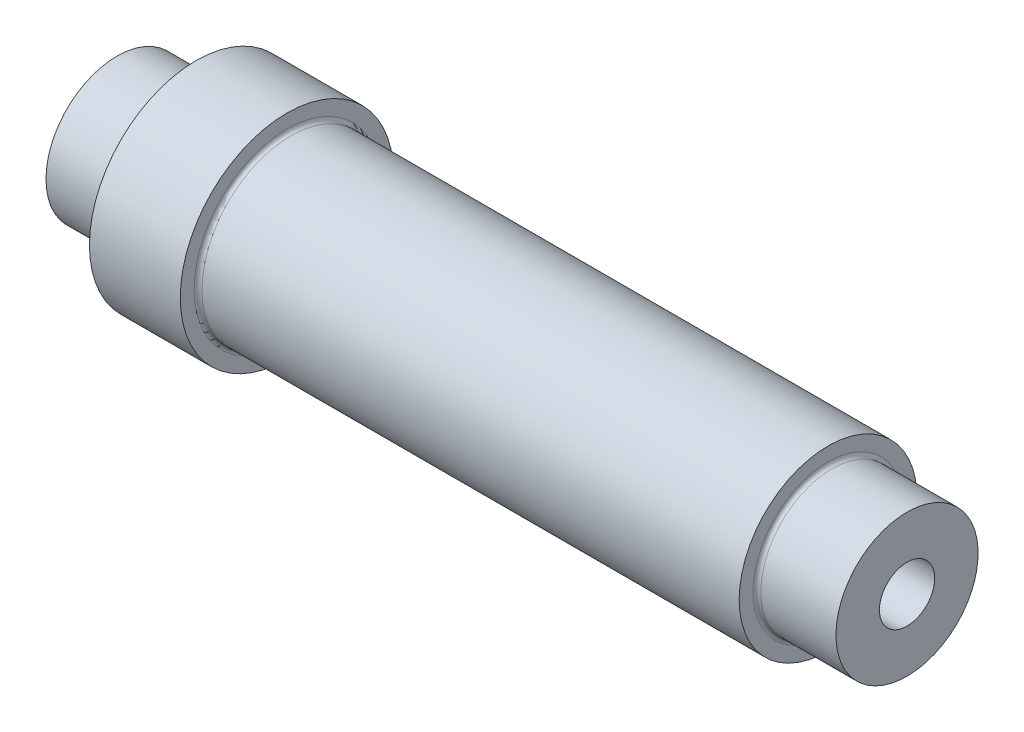
ISO-10303-21;
HEADER;
FILE_DESCRIPTION(('STEP AP214'),'2;1');
FILE_NAME('part.step','',(''),(''),'','','');
FILE_SCHEMA(('AUTOMOTIVE_DESIGN { 1 0 10303 214 1 1 1 1 }'));
ENDSEC;
DATA;
#1=APPLICATION_CONTEXT('core data for automotive mechanical design processes');
#2=APPLICATION_PROTOCOL_DEFINITION('international standard','automotive_design',2000,#1);
#3=PRODUCT_CONTEXT('',#1,'mechanical');
#4=PRODUCT('Part','Part','',(#3));
#5=PRODUCT_RELATED_PRODUCT_CATEGORY('part','',(#4));
#6=PRODUCT_DEFINITION_FORMATION('','',#4);
#7=PRODUCT_DEFINITION_CONTEXT('part definition',#1,'design');
#8=PRODUCT_DEFINITION('design','',#6,#7);
#9=PRODUCT_DEFINITION_SHAPE('','',#8);
#10=(LENGTH_UNIT() NAMED_UNIT(*) SI_UNIT(.MILLI.,.METRE.));
#11=(NAMED_UNIT(*) PLANE_ANGLE_UNIT() SI_UNIT($,.RADIAN.));
#12=(NAMED_UNIT(*) SI_UNIT($,.STERADIAN.) SOLID_ANGLE_UNIT());
#13=UNCERTAINTY_MEASURE_WITH_UNIT(LENGTH_MEASURE(1.E-05),#10,'distance_accuracy_value','');
#14=(GEOMETRIC_REPRESENTATION_CONTEXT(3) GLOBAL_UNCERTAINTY_ASSIGNED_CONTEXT((#13)) GLOBAL_UNIT_ASSIGNED_CONTEXT((#10,
#11,#12)) REPRESENTATION_CONTEXT('',''));
#15=CARTESIAN_POINT('',(0.,0.,0.));
#16=DIRECTION('',(0.,0.,1.));
#17=DIRECTION('',(1.,0.,0.));
#18=AXIS2_PLACEMENT_3D('',#15,#16,#17);
#19=CARTESIAN_POINT('',(0.,0.,0.));
#20=DIRECTION('',(1.,0.,0.));
#21=DIRECTION('',(0.,0.,-1.));
#22=AXIS2_PLACEMENT_3D('',#19,#20,#21);
#23=PLANE('',#22);
#24=CARTESIAN_POINT('',(0.,0.,0.));
#25=DIRECTION('',(-1.,0.,0.));
#26=DIRECTION('',(0.,0.,1.));
#27=AXIS2_PLACEMENT_3D('',#24,#25,#26);
#28=CIRCLE('',#27,7.);
#29=CARTESIAN_POINT('',(0.,0.,7.));
#30=VERTEX_POINT('',#29);
#31=EDGE_CURVE('E57',#30,#30,#28,.T.);
#32=ORIENTED_EDGE('',*,*,#31,.F.);
#33=EDGE_LOOP('',(#32));
#34=FACE_BOUND('',#33,.T.);
#35=CARTESIAN_POINT('',(0.,0.,0.));
#36=DIRECTION('',(-1.,0.,0.));
#37=DIRECTION('',(0.,0.,1.));
#38=AXIS2_PLACEMENT_3D('',#35,#36,#37);
#39=CIRCLE('',#38,18.);
#40=CARTESIAN_POINT('',(0.,0.,18.));
#41=VERTEX_POINT('',#40);
#42=EDGE_CURVE('E80',#41,#41,#39,.T.);
#43=ORIENTED_EDGE('',*,*,#42,.T.);
#44=EDGE_LOOP('',(#43));
#45=FACE_BOUND('',#44,.T.);
#46=ADVANCED_FACE('F33',(#34,#45),#23,.F.);
#47=CARTESIAN_POINT('',(0.,0.,0.));
#48=DIRECTION('',(-1.,0.,0.));
#49=DIRECTION('',(0.,0.,1.));
#50=AXIS2_PLACEMENT_3D('',#47,#48,#49);
#51=CYLINDRICAL_SURFACE('',#50,18.);
#52=CARTESIAN_POINT('',(19.,0.,0.));
#53=DIRECTION('',(1.,0.,0.));
#54=DIRECTION('',(0.,0.,-1.));
#55=AXIS2_PLACEMENT_3D('',#52,#53,#54);
#56=CIRCLE('',#55,18.);
#57=CARTESIAN_POINT('',(19.,0.,-18.));
#58=VERTEX_POINT('',#57);
#59=EDGE_CURVE('E83',#58,#58,#56,.F.);
#60=ORIENTED_EDGE('',*,*,#59,.T.);
#61=EDGE_LOOP('',(#60));
#62=FACE_BOUND('',#61,.T.);
#63=ORIENTED_EDGE('',*,*,#42,.F.);
#64=EDGE_LOOP('',(#63));
#65=FACE_BOUND('',#64,.T.);
#66=ADVANCED_FACE('F110',(#62,#65),#51,.T.);
#67=CARTESIAN_POINT('',(20.,18.,0.));
#68=DIRECTION('',(1.,0.,0.));
#69=DIRECTION('',(0.,0.,-1.));
#70=AXIS2_PLACEMENT_3D('',#67,#68,#69);
#71=PLANE('',#70);
#72=CARTESIAN_POINT('',(20.,0.,0.));
#73=DIRECTION('',(1.,0.,0.));
#74=DIRECTION('',(0.,0.,-1.));
#75=AXIS2_PLACEMENT_3D('',#72,#73,#74);
#76=CIRCLE('',#75,19.);
#77=CARTESIAN_POINT('',(20.,0.,-19.));
#78=VERTEX_POINT('',#77);
#79=EDGE_CURVE('E86',#78,#78,#76,.T.);
#80=ORIENTED_EDGE('',*,*,#79,.T.);
#81=EDGE_LOOP('',(#80));
#82=FACE_BOUND('',#81,.T.);
#83=CARTESIAN_POINT('',(20.,0.,0.));
#84=DIRECTION('',(-1.,0.,0.));
#85=DIRECTION('',(0.,0.,1.));
#86=AXIS2_PLACEMENT_3D('',#83,#84,#85);
#87=CIRCLE('',#86,27.);
#88=CARTESIAN_POINT('',(20.,0.,27.));
#89=VERTEX_POINT('',#88);
#90=EDGE_CURVE('E77',#89,#89,#87,.T.);
#91=ORIENTED_EDGE('',*,*,#90,.T.);
#92=EDGE_LOOP('',(#91));
#93=FACE_BOUND('',#92,.T.);
#94=ADVANCED_FACE('F116',(#82,#93),#71,.F.);
#95=CARTESIAN_POINT('',(0.,0.,0.));
#96=DIRECTION('',(-1.,0.,0.));
#97=DIRECTION('',(0.,0.,1.));
#98=AXIS2_PLACEMENT_3D('',#95,#96,#97);
#99=CYLINDRICAL_SURFACE('',#98,27.);
#100=ORIENTED_EDGE('',*,*,#90,.F.);
#101=EDGE_LOOP('',(#100));
#102=FACE_BOUND('',#101,.T.);
#103=CARTESIAN_POINT('',(43.,0.,0.));
#104=DIRECTION('',(-1.,0.,0.));
#105=DIRECTION('',(0.,0.,1.));
#106=AXIS2_PLACEMENT_3D('',#103,#104,#105);
#107=CIRCLE('',#106,27.);
#108=CARTESIAN_POINT('',(43.,0.,27.));
#109=VERTEX_POINT('',#108);
#110=EDGE_CURVE('E74',#109,#109,#107,.T.);
#111=ORIENTED_EDGE('',*,*,#110,.T.);
#112=EDGE_LOOP('',(#111));
#113=FACE_BOUND('',#112,.T.);
#114=ADVANCED_FACE('F137',(#102,#113),#99,.T.);
#115=CARTESIAN_POINT('',(43.,27.,0.));
#116=DIRECTION('',(-1.,0.,0.));
#117=DIRECTION('',(0.,0.,1.));
#118=AXIS2_PLACEMENT_3D('',#115,#116,#117);
#119=PLANE('',#118);
#120=CARTESIAN_POINT('',(43.,0.,0.));
#121=DIRECTION('',(-1.,0.,0.));
#122=DIRECTION('',(0.,0.,1.));
#123=AXIS2_PLACEMENT_3D('',#120,#121,#122);
#124=CIRCLE('',#123,23.5);
#125=CARTESIAN_POINT('',(43.,0.,23.5));
#126=VERTEX_POINT('',#125);
#127=EDGE_CURVE('E41',#126,#126,#124,.T.);
#128=ORIENTED_EDGE('',*,*,#127,.T.);
#129=EDGE_LOOP('',(#128));
#130=FACE_BOUND('',#129,.T.);
#131=ORIENTED_EDGE('',*,*,#110,.F.);
#132=EDGE_LOOP('',(#131));
#133=FACE_BOUND('',#132,.T.);
#134=ADVANCED_FACE('F97',(#130,#133),#119,.F.);
#135=CARTESIAN_POINT('',(0.,0.,0.));
#136=DIRECTION('',(-1.,0.,0.));
#137=DIRECTION('',(0.,0.,1.));
#138=AXIS2_PLACEMENT_3D('',#135,#136,#137);
#139=CYLINDRICAL_SURFACE('',#138,22.5);
#140=CARTESIAN_POINT('',(44.,0.,0.));
#141=DIRECTION('',(-1.,0.,0.));
#142=DIRECTION('',(0.,0.,1.));
#143=AXIS2_PLACEMENT_3D('',#140,#141,#142);
#144=CIRCLE('',#143,22.5);
#145=CARTESIAN_POINT('',(44.,0.,22.5));
#146=VERTEX_POINT('',#145);
#147=EDGE_CURVE('E11',#146,#146,#144,.F.);
#148=ORIENTED_EDGE('',*,*,#147,.T.);
#149=EDGE_LOOP('',(#148));
#150=FACE_BOUND('',#149,.T.);
#151=CARTESIAN_POINT('',(180.,0.,0.));
#152=DIRECTION('',(-1.,0.,0.));
#153=DIRECTION('',(0.,0.,1.));
#154=AXIS2_PLACEMENT_3D('',#151,#152,#153);
#155=CIRCLE('',#154,22.5);
#156=CARTESIAN_POINT('',(180.,0.,22.5));
#157=VERTEX_POINT('',#156);
#158=EDGE_CURVE('E71',#157,#157,#155,.T.);
#159=ORIENTED_EDGE('',*,*,#158,.T.);
#160=EDGE_LOOP('',(#159));
#161=FACE_BOUND('',#160,.T.);
#162=ADVANCED_FACE('F145',(#150,#161),#139,.T.);
#163=CARTESIAN_POINT('',(180.,22.5,0.));
#164=DIRECTION('',(-1.,0.,0.));
#165=DIRECTION('',(0.,0.,1.));
#166=AXIS2_PLACEMENT_3D('',#163,#164,#165);
#167=PLANE('',#166);
#168=CARTESIAN_POINT('',(180.,0.,0.));
#169=DIRECTION('',(-1.,0.,0.));
#170=DIRECTION('',(0.,0.,1.));
#171=AXIS2_PLACEMENT_3D('',#168,#169,#170);
#172=CIRCLE('',#171,19.);
#173=CARTESIAN_POINT('',(180.,0.,19.));
#174=VERTEX_POINT('',#173);
#175=EDGE_CURVE('E89',#174,#174,#172,.T.);
#176=ORIENTED_EDGE('',*,*,#175,.T.);
#177=EDGE_LOOP('',(#176));
#178=FACE_BOUND('',#177,.T.);
#179=ORIENTED_EDGE('',*,*,#158,.F.);
#180=EDGE_LOOP('',(#179));
#181=FACE_BOUND('',#180,.T.);
#182=ADVANCED_FACE('F150',(#178,#181),#167,.F.);
#183=CARTESIAN_POINT('',(0.,0.,0.));
#184=DIRECTION('',(-1.,0.,0.));
#185=DIRECTION('',(0.,0.,1.));
#186=AXIS2_PLACEMENT_3D('',#183,#184,#185);
#187=CYLINDRICAL_SURFACE('',#186,18.);
#188=CARTESIAN_POINT('',(181.,0.,0.));
#189=DIRECTION('',(-1.,0.,0.));
#190=DIRECTION('',(0.,0.,1.));
#191=AXIS2_PLACEMENT_3D('',#188,#189,#190);
#192=CIRCLE('',#191,18.);
#193=CARTESIAN_POINT('',(181.,0.,18.));
#194=VERTEX_POINT('',#193);
#195=EDGE_CURVE('E92',#194,#194,#192,.F.);
#196=ORIENTED_EDGE('',*,*,#195,.T.);
#197=EDGE_LOOP('',(#196));
#198=FACE_BOUND('',#197,.T.);
#199=CARTESIAN_POINT('',(200.,0.,0.));
#200=DIRECTION('',(-1.,0.,0.));
#201=DIRECTION('',(0.,0.,1.));
#202=AXIS2_PLACEMENT_3D('',#199,#200,#201);
#203=CIRCLE('',#202,18.);
#204=CARTESIAN_POINT('',(200.,0.,18.));
#205=VERTEX_POINT('',#204);
#206=EDGE_CURVE('E68',#205,#205,#203,.T.);
#207=ORIENTED_EDGE('',*,*,#206,.T.);
#208=EDGE_LOOP('',(#207));
#209=FACE_BOUND('',#208,.T.);
#210=ADVANCED_FACE('F156',(#198,#209),#187,.T.);
#211=CARTESIAN_POINT('',(200.,18.,0.));
#212=DIRECTION('',(-1.,0.,0.));
#213=DIRECTION('',(0.,0.,1.));
#214=AXIS2_PLACEMENT_3D('',#211,#212,#213);
#215=PLANE('',#214);
#216=CARTESIAN_POINT('',(200.,0.,0.));
#217=DIRECTION('',(1.,0.,0.));
#218=DIRECTION('',(0.,0.,-1.));
#219=AXIS2_PLACEMENT_3D('',#216,#217,#218);
#220=CIRCLE('',#219,7.);
#221=CARTESIAN_POINT('',(200.,0.,-7.));
#222=VERTEX_POINT('',#221);
#223=EDGE_CURVE('E58',#222,#222,#220,.T.);
#224=ORIENTED_EDGE('',*,*,#223,.F.);
#225=EDGE_LOOP('',(#224));
#226=FACE_BOUND('',#225,.T.);
#227=ORIENTED_EDGE('',*,*,#206,.F.);
#228=EDGE_LOOP('',(#227));
#229=FACE_BOUND('',#228,.T.);
#230=ADVANCED_FACE('F160',(#226,#229),#215,.F.);
#231=CARTESIAN_POINT('',(30.,0.,0.));
#232=DIRECTION('',(-1.,0.,0.));
#233=DIRECTION('',(0.,0.,1.));
#234=AXIS2_PLACEMENT_3D('',#231,#232,#233);
#235=CONICAL_SURFACE('',#234,6.99999999999999,1.02974425867665);
#236=CARTESIAN_POINT('',(34.2060243331929,0.,0.));
#237=VERTEX_POINT('',#236);
#238=VERTEX_LOOP('',#237);
#239=FACE_BOUND('',#238,.T.);
#240=CARTESIAN_POINT('',(30.,0.,0.));
#241=DIRECTION('',(-1.,0.,0.));
#242=DIRECTION('',(0.,0.,1.));
#243=AXIS2_PLACEMENT_3D('',#240,#241,#242);
#244=CIRCLE('',#243,6.99999999999999);
#245=CARTESIAN_POINT('',(30.,0.,6.99999999999999));
#246=VERTEX_POINT('',#245);
#247=EDGE_CURVE('E61',#246,#246,#244,.T.);
#248=ORIENTED_EDGE('',*,*,#247,.T.);
#249=EDGE_LOOP('',(#248));
#250=FACE_BOUND('',#249,.T.);
#251=ADVANCED_FACE('F164',(#239,#250),#235,.F.);
#252=CARTESIAN_POINT('',(0.,0.,0.));
#253=DIRECTION('',(-1.,0.,0.));
#254=DIRECTION('',(0.,0.,1.));
#255=AXIS2_PLACEMENT_3D('',#252,#253,#254);
#256=CYLINDRICAL_SURFACE('',#255,6.99999999999999);
#257=ORIENTED_EDGE('',*,*,#247,.F.);
#258=EDGE_LOOP('',(#257));
#259=FACE_BOUND('',#258,.T.);
#260=ORIENTED_EDGE('',*,*,#31,.T.);
#261=EDGE_LOOP('',(#260));
#262=FACE_BOUND('',#261,.T.);
#263=ADVANCED_FACE('F51',(#259,#262),#256,.F.);
#264=CARTESIAN_POINT('',(170.,0.,0.));
#265=DIRECTION('',(1.,0.,0.));
#266=DIRECTION('',(0.,0.,-1.));
#267=AXIS2_PLACEMENT_3D('',#264,#265,#266);
#268=CONICAL_SURFACE('',#267,6.99999999999999,1.02974425867665);
#269=CARTESIAN_POINT('',(165.793975666807,0.,0.));
#270=VERTEX_POINT('',#269);
#271=VERTEX_LOOP('',#270);
#272=FACE_BOUND('',#271,.T.);
#273=CARTESIAN_POINT('',(170.,0.,0.));
#274=DIRECTION('',(1.,0.,0.));
#275=DIRECTION('',(0.,0.,-1.));
#276=AXIS2_PLACEMENT_3D('',#273,#274,#275);
#277=CIRCLE('',#276,6.99999999999999);
#278=CARTESIAN_POINT('',(170.,0.,-6.99999999999999));
#279=VERTEX_POINT('',#278);
#280=EDGE_CURVE('E55',#279,#279,#277,.T.);
#281=ORIENTED_EDGE('',*,*,#280,.T.);
#282=EDGE_LOOP('',(#281));
#283=FACE_BOUND('',#282,.T.);
#284=ADVANCED_FACE('F47',(#272,#283),#268,.F.);
#285=CARTESIAN_POINT('',(200.,0.,0.));
#286=DIRECTION('',(1.,0.,0.));
#287=DIRECTION('',(0.,0.,-1.));
#288=AXIS2_PLACEMENT_3D('',#285,#286,#287);
#289=CYLINDRICAL_SURFACE('',#288,6.99999999999999);
#290=ORIENTED_EDGE('',*,*,#280,.F.);
#291=EDGE_LOOP('',(#290));
#292=FACE_BOUND('',#291,.T.);
#293=ORIENTED_EDGE('',*,*,#223,.T.);
#294=EDGE_LOOP('',(#293));
#295=FACE_BOUND('',#294,.T.);
#296=ADVANCED_FACE('F50',(#292,#295),#289,.F.);
#297=CARTESIAN_POINT('',(19.,0.,0.));
#298=DIRECTION('',(1.,0.,0.));
#299=DIRECTION('',(0.,0.,-1.));
#300=AXIS2_PLACEMENT_3D('',#297,#298,#299);
#301=TOROIDAL_SURFACE('',#300,19.,1.);
#302=ORIENTED_EDGE('',*,*,#79,.F.);
#303=EDGE_LOOP('',(#302));
#304=FACE_BOUND('',#303,.T.);
#305=ORIENTED_EDGE('',*,*,#59,.F.);
#306=EDGE_LOOP('',(#305));
#307=FACE_BOUND('',#306,.T.);
#308=ADVANCED_FACE('F106',(#304,#307),#301,.F.);
#309=CARTESIAN_POINT('',(181.,0.,0.));
#310=DIRECTION('',(-1.,0.,0.));
#311=DIRECTION('',(0.,0.,1.));
#312=AXIS2_PLACEMENT_3D('',#309,#310,#311);
#313=TOROIDAL_SURFACE('',#312,19.,1.);
#314=ORIENTED_EDGE('',*,*,#195,.F.);
#315=EDGE_LOOP('',(#314));
#316=FACE_BOUND('',#315,.T.);
#317=ORIENTED_EDGE('',*,*,#175,.F.);
#318=EDGE_LOOP('',(#317));
#319=FACE_BOUND('',#318,.T.);
#320=ADVANCED_FACE('F101',(#316,#319),#313,.F.);
#321=CARTESIAN_POINT('',(44.,0.,0.));
#322=DIRECTION('',(-1.,0.,0.));
#323=DIRECTION('',(0.,0.,1.));
#324=AXIS2_PLACEMENT_3D('',#321,#322,#323);
#325=TOROIDAL_SURFACE('',#324,23.5,1.);
#326=ORIENTED_EDGE('',*,*,#147,.F.);
#327=EDGE_LOOP('',(#326));
#328=FACE_BOUND('',#327,.T.);
#329=ORIENTED_EDGE('',*,*,#127,.F.);
#330=EDGE_LOOP('',(#329));
#331=FACE_BOUND('',#330,.T.);
#332=ADVANCED_FACE('F35',(#328,#331),#325,.F.);
#333=CLOSED_SHELL('',(#46,#66,#94,#114,#134,#162,#182,#210,#230,#251,#263,#284,#296,#308,#320,#332));
#334=MANIFOLD_SOLID_BREP('B2',#333);
#335=ADVANCED_BREP_SHAPE_REPRESENTATION('',(#18,#334),#14);
#336=SHAPE_DEFINITION_REPRESENTATION(#9,#335);
ENDSEC;
END-ISO-10303-21;
